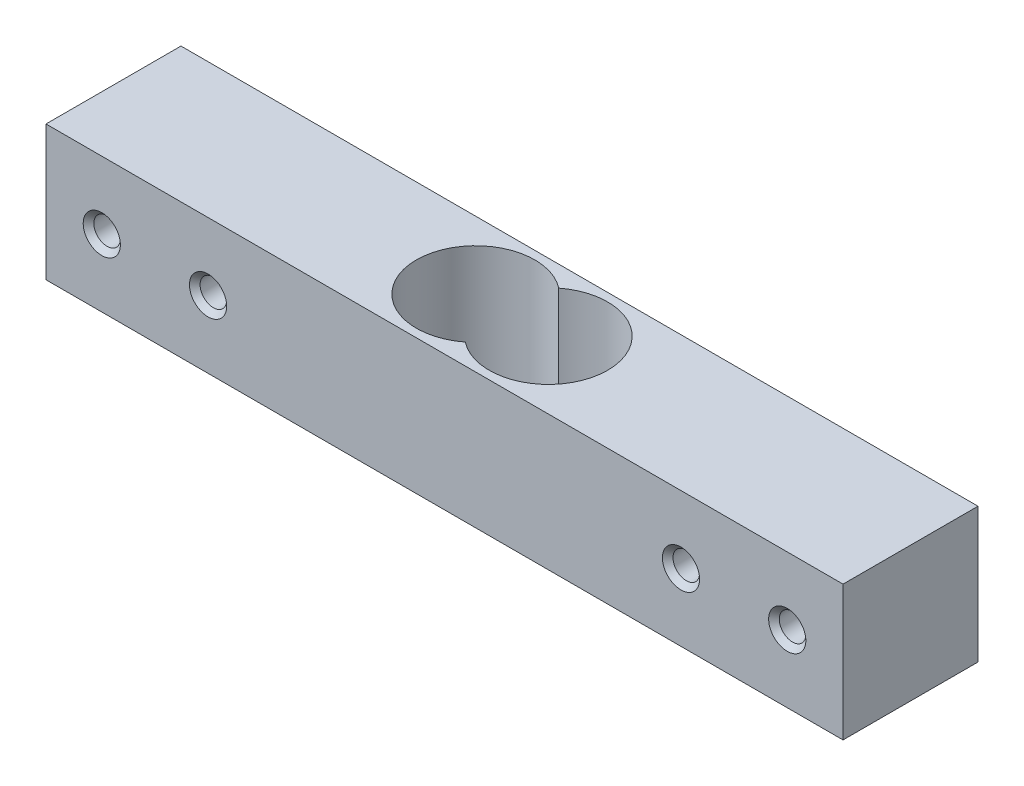
ISO-10303-21;
HEADER;
FILE_DESCRIPTION(('STEP AP214'),'2;1');
FILE_NAME('part.step','',(''),(''),'','','');
FILE_SCHEMA(('AUTOMOTIVE_DESIGN { 1 0 10303 214 1 1 1 1 }'));
ENDSEC;
DATA;
#1=APPLICATION_CONTEXT('core data for automotive mechanical design processes');
#2=APPLICATION_PROTOCOL_DEFINITION('international standard','automotive_design',2000,#1);
#3=PRODUCT_CONTEXT('',#1,'mechanical');
#4=PRODUCT('Part','Part','',(#3));
#5=PRODUCT_RELATED_PRODUCT_CATEGORY('part','',(#4));
#6=PRODUCT_DEFINITION_FORMATION('','',#4);
#7=PRODUCT_DEFINITION_CONTEXT('part definition',#1,'design');
#8=PRODUCT_DEFINITION('design','',#6,#7);
#9=PRODUCT_DEFINITION_SHAPE('','',#8);
#10=(LENGTH_UNIT() NAMED_UNIT(*) SI_UNIT(.MILLI.,.METRE.));
#11=(NAMED_UNIT(*) PLANE_ANGLE_UNIT() SI_UNIT($,.RADIAN.));
#12=(NAMED_UNIT(*) SI_UNIT($,.STERADIAN.) SOLID_ANGLE_UNIT());
#13=UNCERTAINTY_MEASURE_WITH_UNIT(LENGTH_MEASURE(1.E-05),#10,'distance_accuracy_value','');
#14=(GEOMETRIC_REPRESENTATION_CONTEXT(3) GLOBAL_UNCERTAINTY_ASSIGNED_CONTEXT((#13)) GLOBAL_UNIT_ASSIGNED_CONTEXT((#10,
#11,#12)) REPRESENTATION_CONTEXT('',''));
#15=CARTESIAN_POINT('',(0.,0.,0.));
#16=DIRECTION('',(0.,0.,1.));
#17=DIRECTION('',(1.,0.,0.));
#18=AXIS2_PLACEMENT_3D('',#15,#16,#17);
#19=CARTESIAN_POINT('',(0.,6.35,6.35));
#20=DIRECTION('',(0.,0.,-1.));
#21=DIRECTION('',(-1.,0.,0.));
#22=AXIS2_PLACEMENT_3D('',#19,#20,#21);
#23=PLANE('',#22);
#24=CARTESIAN_POINT('',(-32.25,0.,6.35));
#25=DIRECTION('',(0.,0.,-1.));
#26=DIRECTION('',(-1.,0.,0.));
#27=AXIS2_PLACEMENT_3D('',#24,#25,#26);
#28=CIRCLE('',#27,1.75);
#29=CARTESIAN_POINT('',(-34.,0.,6.35));
#30=VERTEX_POINT('',#29);
#31=EDGE_CURVE('E232',#30,#30,#28,.T.);
#32=ORIENTED_EDGE('',*,*,#31,.T.);
#33=EDGE_LOOP('',(#32));
#34=FACE_BOUND('',#33,.T.);
#35=CARTESIAN_POINT('',(-22.25,0.,6.35));
#36=DIRECTION('',(0.,0.,-1.));
#37=DIRECTION('',(-1.,0.,0.));
#38=AXIS2_PLACEMENT_3D('',#35,#36,#37);
#39=CIRCLE('',#38,1.75);
#40=CARTESIAN_POINT('',(-24.,0.,6.35));
#41=VERTEX_POINT('',#40);
#42=EDGE_CURVE('E240',#41,#41,#39,.T.);
#43=ORIENTED_EDGE('',*,*,#42,.T.);
#44=EDGE_LOOP('',(#43));
#45=FACE_BOUND('',#44,.T.);
#46=CARTESIAN_POINT('',(22.25,0.,6.35));
#47=DIRECTION('',(0.,0.,-1.));
#48=DIRECTION('',(-1.,0.,0.));
#49=AXIS2_PLACEMENT_3D('',#46,#47,#48);
#50=CIRCLE('',#49,1.75);
#51=CARTESIAN_POINT('',(20.5,0.,6.35));
#52=VERTEX_POINT('',#51);
#53=EDGE_CURVE('E249',#52,#52,#50,.T.);
#54=ORIENTED_EDGE('',*,*,#53,.T.);
#55=EDGE_LOOP('',(#54));
#56=FACE_BOUND('',#55,.T.);
#57=CARTESIAN_POINT('',(32.25,0.,6.35));
#58=DIRECTION('',(0.,0.,-1.));
#59=DIRECTION('',(-1.,0.,0.));
#60=AXIS2_PLACEMENT_3D('',#57,#58,#59);
#61=CIRCLE('',#60,1.74999999999999);
#62=CARTESIAN_POINT('',(30.5,0.,6.35));
#63=VERTEX_POINT('',#62);
#64=EDGE_CURVE('E212',#63,#63,#61,.T.);
#65=ORIENTED_EDGE('',*,*,#64,.T.);
#66=EDGE_LOOP('',(#65));
#67=FACE_BOUND('',#66,.T.);
#68=DIRECTION('',(1.,0.,0.));
#69=VECTOR('',#68,1.);
#70=CARTESIAN_POINT('',(0.,-6.35,6.35));
#71=LINE('',#70,#69);
#72=CARTESIAN_POINT('',(-37.5,-6.35,6.35));
#73=VERTEX_POINT('',#72);
#74=CARTESIAN_POINT('',(37.5,-6.35,6.35));
#75=VERTEX_POINT('',#74);
#76=EDGE_CURVE('E140',#73,#75,#71,.T.);
#77=ORIENTED_EDGE('',*,*,#76,.T.);
#78=DIRECTION('',(0.,-1.,0.));
#79=VECTOR('',#78,1.);
#80=CARTESIAN_POINT('',(37.5,6.35,6.35));
#81=LINE('',#80,#79);
#82=CARTESIAN_POINT('',(37.5,6.35,6.35));
#83=VERTEX_POINT('',#82);
#84=EDGE_CURVE('E11',#83,#75,#81,.T.);
#85=ORIENTED_EDGE('',*,*,#84,.F.);
#86=DIRECTION('',(1.,0.,0.));
#87=VECTOR('',#86,1.);
#88=CARTESIAN_POINT('',(0.,6.35,6.35));
#89=LINE('',#88,#87);
#90=CARTESIAN_POINT('',(-37.5,6.35,6.35));
#91=VERTEX_POINT('',#90);
#92=EDGE_CURVE('E108',#91,#83,#89,.T.);
#93=ORIENTED_EDGE('',*,*,#92,.F.);
#94=DIRECTION('',(0.,-1.,0.));
#95=VECTOR('',#94,1.);
#96=CARTESIAN_POINT('',(-37.5,6.35,6.35));
#97=LINE('',#96,#95);
#98=EDGE_CURVE('E60',#91,#73,#97,.T.);
#99=ORIENTED_EDGE('',*,*,#98,.T.);
#100=EDGE_LOOP('',(#77,#85,#93,#99));
#101=FACE_BOUND('',#100,.T.);
#102=ADVANCED_FACE('F40',(#34,#45,#56,#67,#101),#23,.F.);
#103=CARTESIAN_POINT('',(37.5,6.35,0.));
#104=DIRECTION('',(-1.,0.,0.));
#105=DIRECTION('',(0.,0.,1.));
#106=AXIS2_PLACEMENT_3D('',#103,#104,#105);
#107=PLANE('',#106);
#108=DIRECTION('',(0.,0.,-1.));
#109=VECTOR('',#108,1.);
#110=CARTESIAN_POINT('',(37.5,-6.35,0.));
#111=LINE('',#110,#109);
#112=CARTESIAN_POINT('',(37.5,-6.35,-6.35));
#113=VERTEX_POINT('',#112);
#114=EDGE_CURVE('E115',#75,#113,#111,.T.);
#115=ORIENTED_EDGE('',*,*,#114,.T.);
#116=DIRECTION('',(0.,-1.,0.));
#117=VECTOR('',#116,1.);
#118=CARTESIAN_POINT('',(37.5,6.35,-6.35));
#119=LINE('',#118,#117);
#120=CARTESIAN_POINT('',(37.5,6.35,-6.35));
#121=VERTEX_POINT('',#120);
#122=EDGE_CURVE('E51',#121,#113,#119,.T.);
#123=ORIENTED_EDGE('',*,*,#122,.F.);
#124=DIRECTION('',(0.,0.,-1.));
#125=VECTOR('',#124,1.);
#126=CARTESIAN_POINT('',(37.5,6.35,0.));
#127=LINE('',#126,#125);
#128=EDGE_CURVE('E102',#83,#121,#127,.T.);
#129=ORIENTED_EDGE('',*,*,#128,.F.);
#130=ORIENTED_EDGE('',*,*,#84,.T.);
#131=EDGE_LOOP('',(#115,#123,#129,#130));
#132=FACE_BOUND('',#131,.T.);
#133=ADVANCED_FACE('F114',(#132),#107,.F.);
#134=CARTESIAN_POINT('',(0.,6.35,-6.35));
#135=DIRECTION('',(0.,0.,-1.));
#136=DIRECTION('',(-1.,0.,0.));
#137=AXIS2_PLACEMENT_3D('',#134,#135,#136);
#138=PLANE('',#137);
#139=CARTESIAN_POINT('',(-32.25,0.,-6.35));
#140=DIRECTION('',(0.,0.,-1.));
#141=DIRECTION('',(-1.,0.,0.));
#142=AXIS2_PLACEMENT_3D('',#139,#140,#141);
#143=CIRCLE('',#142,1.75);
#144=CARTESIAN_POINT('',(-34.,0.,-6.35));
#145=VERTEX_POINT('',#144);
#146=EDGE_CURVE('E197',#145,#145,#143,.T.);
#147=ORIENTED_EDGE('',*,*,#146,.F.);
#148=EDGE_LOOP('',(#147));
#149=FACE_BOUND('',#148,.T.);
#150=CARTESIAN_POINT('',(-22.25,0.,-6.35));
#151=DIRECTION('',(0.,0.,-1.));
#152=DIRECTION('',(-1.,0.,0.));
#153=AXIS2_PLACEMENT_3D('',#150,#151,#152);
#154=CIRCLE('',#153,1.75);
#155=CARTESIAN_POINT('',(-24.,0.,-6.35));
#156=VERTEX_POINT('',#155);
#157=EDGE_CURVE('E201',#156,#156,#154,.T.);
#158=ORIENTED_EDGE('',*,*,#157,.F.);
#159=EDGE_LOOP('',(#158));
#160=FACE_BOUND('',#159,.T.);
#161=CARTESIAN_POINT('',(22.25,0.,-6.35));
#162=DIRECTION('',(0.,0.,-1.));
#163=DIRECTION('',(-1.,0.,0.));
#164=AXIS2_PLACEMENT_3D('',#161,#162,#163);
#165=CIRCLE('',#164,1.75);
#166=CARTESIAN_POINT('',(20.5,0.,-6.35));
#167=VERTEX_POINT('',#166);
#168=EDGE_CURVE('E205',#167,#167,#165,.T.);
#169=ORIENTED_EDGE('',*,*,#168,.F.);
#170=EDGE_LOOP('',(#169));
#171=FACE_BOUND('',#170,.T.);
#172=CARTESIAN_POINT('',(32.25,0.,-6.35));
#173=DIRECTION('',(0.,0.,-1.));
#174=DIRECTION('',(-1.,0.,0.));
#175=AXIS2_PLACEMENT_3D('',#172,#173,#174);
#176=CIRCLE('',#175,1.75);
#177=CARTESIAN_POINT('',(30.5,0.,-6.35));
#178=VERTEX_POINT('',#177);
#179=EDGE_CURVE('E208',#178,#178,#176,.T.);
#180=ORIENTED_EDGE('',*,*,#179,.F.);
#181=EDGE_LOOP('',(#180));
#182=FACE_BOUND('',#181,.T.);
#183=DIRECTION('',(1.,0.,0.));
#184=VECTOR('',#183,1.);
#185=CARTESIAN_POINT('',(0.,-6.35,-6.35));
#186=LINE('',#185,#184);
#187=CARTESIAN_POINT('',(-37.5,-6.35,-6.35));
#188=VERTEX_POINT('',#187);
#189=EDGE_CURVE('E145',#188,#113,#186,.T.);
#190=ORIENTED_EDGE('',*,*,#189,.F.);
#191=DIRECTION('',(0.,-1.,0.));
#192=VECTOR('',#191,1.);
#193=CARTESIAN_POINT('',(-37.5,6.35,-6.35));
#194=LINE('',#193,#192);
#195=CARTESIAN_POINT('',(-37.5,6.35,-6.35));
#196=VERTEX_POINT('',#195);
#197=EDGE_CURVE('E80',#196,#188,#194,.T.);
#198=ORIENTED_EDGE('',*,*,#197,.F.);
#199=DIRECTION('',(1.,0.,0.));
#200=VECTOR('',#199,1.);
#201=CARTESIAN_POINT('',(0.,6.35,-6.35));
#202=LINE('',#201,#200);
#203=EDGE_CURVE('E107',#196,#121,#202,.T.);
#204=ORIENTED_EDGE('',*,*,#203,.T.);
#205=ORIENTED_EDGE('',*,*,#122,.T.);
#206=EDGE_LOOP('',(#190,#198,#204,#205));
#207=FACE_BOUND('',#206,.T.);
#208=ADVANCED_FACE('F120',(#149,#160,#171,#182,#207),#138,.T.);
#209=CARTESIAN_POINT('',(3.425,6.35,0.));
#210=DIRECTION('',(0.,-1.,0.));
#211=DIRECTION('',(0.,0.,-1.));
#212=AXIS2_PLACEMENT_3D('',#209,#210,#211);
#213=CYLINDRICAL_SURFACE('',#212,5.575);
#214=CARTESIAN_POINT('',(3.425,-6.35,0.));
#215=DIRECTION('',(0.,1.,0.));
#216=DIRECTION('',(0.,0.,1.));
#217=AXIS2_PLACEMENT_3D('',#214,#215,#216);
#218=CIRCLE('',#217,5.575);
#219=CARTESIAN_POINT('',(0.,-6.35,4.39886348958455));
#220=VERTEX_POINT('',#219);
#221=CARTESIAN_POINT('',(0.,-6.35,-4.39886348958455));
#222=VERTEX_POINT('',#221);
#223=EDGE_CURVE('E131',#220,#222,#218,.T.);
#224=ORIENTED_EDGE('',*,*,#223,.F.);
#225=DIRECTION('',(0.,-1.,0.));
#226=VECTOR('',#225,1.);
#227=CARTESIAN_POINT('',(0.,6.35,4.39886348958455));
#228=LINE('',#227,#226);
#229=CARTESIAN_POINT('',(0.,6.35,4.39886348958455));
#230=VERTEX_POINT('',#229);
#231=EDGE_CURVE('E44',#230,#220,#228,.T.);
#232=ORIENTED_EDGE('',*,*,#231,.F.);
#233=CARTESIAN_POINT('',(3.425,6.35,0.));
#234=DIRECTION('',(0.,1.,0.));
#235=DIRECTION('',(0.,0.,1.));
#236=AXIS2_PLACEMENT_3D('',#233,#234,#235);
#237=CIRCLE('',#236,5.575);
#238=CARTESIAN_POINT('',(0.,6.35,-4.39886348958455));
#239=VERTEX_POINT('',#238);
#240=EDGE_CURVE('E152',#230,#239,#237,.T.);
#241=ORIENTED_EDGE('',*,*,#240,.T.);
#242=DIRECTION('',(0.,-1.,0.));
#243=VECTOR('',#242,1.);
#244=CARTESIAN_POINT('',(0.,6.35,-4.39886348958455));
#245=LINE('',#244,#243);
#246=EDGE_CURVE('E127',#239,#222,#245,.T.);
#247=ORIENTED_EDGE('',*,*,#246,.T.);
#248=EDGE_LOOP('',(#224,#232,#241,#247));
#249=FACE_BOUND('',#248,.T.);
#250=ADVANCED_FACE('F42',(#249),#213,.F.);
#251=CARTESIAN_POINT('',(-3.425,6.35,0.));
#252=DIRECTION('',(0.,-1.,0.));
#253=DIRECTION('',(0.,0.,-1.));
#254=AXIS2_PLACEMENT_3D('',#251,#252,#253);
#255=CYLINDRICAL_SURFACE('',#254,5.575);
#256=CARTESIAN_POINT('',(-3.425,-6.35,0.));
#257=DIRECTION('',(0.,1.,0.));
#258=DIRECTION('',(0.,0.,1.));
#259=AXIS2_PLACEMENT_3D('',#256,#257,#258);
#260=CIRCLE('',#259,5.575);
#261=EDGE_CURVE('E135',#222,#220,#260,.T.);
#262=ORIENTED_EDGE('',*,*,#261,.F.);
#263=ORIENTED_EDGE('',*,*,#246,.F.);
#264=CARTESIAN_POINT('',(-3.425,6.35,0.));
#265=DIRECTION('',(0.,1.,0.));
#266=DIRECTION('',(0.,0.,1.));
#267=AXIS2_PLACEMENT_3D('',#264,#265,#266);
#268=CIRCLE('',#267,5.575);
#269=EDGE_CURVE('E163',#239,#230,#268,.T.);
#270=ORIENTED_EDGE('',*,*,#269,.T.);
#271=ORIENTED_EDGE('',*,*,#231,.T.);
#272=EDGE_LOOP('',(#262,#263,#270,#271));
#273=FACE_BOUND('',#272,.T.);
#274=ADVANCED_FACE('F161',(#273),#255,.F.);
#275=CARTESIAN_POINT('',(-37.5,6.35,0.));
#276=DIRECTION('',(-1.,0.,0.));
#277=DIRECTION('',(0.,0.,1.));
#278=AXIS2_PLACEMENT_3D('',#275,#276,#277);
#279=PLANE('',#278);
#280=DIRECTION('',(0.,0.,-1.));
#281=VECTOR('',#280,1.);
#282=CARTESIAN_POINT('',(-37.5,-6.35,0.));
#283=LINE('',#282,#281);
#284=EDGE_CURVE('E148',#73,#188,#283,.T.);
#285=ORIENTED_EDGE('',*,*,#284,.F.);
#286=ORIENTED_EDGE('',*,*,#98,.F.);
#287=DIRECTION('',(0.,0.,-1.));
#288=VECTOR('',#287,1.);
#289=CARTESIAN_POINT('',(-37.5,6.35,0.));
#290=LINE('',#289,#288);
#291=EDGE_CURVE('E122',#91,#196,#290,.T.);
#292=ORIENTED_EDGE('',*,*,#291,.T.);
#293=ORIENTED_EDGE('',*,*,#197,.T.);
#294=EDGE_LOOP('',(#285,#286,#292,#293));
#295=FACE_BOUND('',#294,.T.);
#296=ADVANCED_FACE('F170',(#295),#279,.T.);
#297=CARTESIAN_POINT('',(0.,6.35,0.));
#298=DIRECTION('',(0.,1.,0.));
#299=DIRECTION('',(0.,0.,1.));
#300=AXIS2_PLACEMENT_3D('',#297,#298,#299);
#301=PLANE('',#300);
#302=ORIENTED_EDGE('',*,*,#240,.F.);
#303=ORIENTED_EDGE('',*,*,#269,.F.);
#304=EDGE_LOOP('',(#302,#303));
#305=FACE_BOUND('',#304,.T.);
#306=ORIENTED_EDGE('',*,*,#92,.T.);
#307=ORIENTED_EDGE('',*,*,#128,.T.);
#308=ORIENTED_EDGE('',*,*,#203,.F.);
#309=ORIENTED_EDGE('',*,*,#291,.F.);
#310=EDGE_LOOP('',(#306,#307,#308,#309));
#311=FACE_BOUND('',#310,.T.);
#312=ADVANCED_FACE('F104',(#305,#311),#301,.T.);
#313=CARTESIAN_POINT('',(0.,-6.35,0.));
#314=DIRECTION('',(0.,1.,0.));
#315=DIRECTION('',(0.,0.,1.));
#316=AXIS2_PLACEMENT_3D('',#313,#314,#315);
#317=PLANE('',#316);
#318=ORIENTED_EDGE('',*,*,#223,.T.);
#319=ORIENTED_EDGE('',*,*,#261,.T.);
#320=EDGE_LOOP('',(#318,#319));
#321=FACE_BOUND('',#320,.T.);
#322=ORIENTED_EDGE('',*,*,#76,.F.);
#323=ORIENTED_EDGE('',*,*,#284,.T.);
#324=ORIENTED_EDGE('',*,*,#189,.T.);
#325=ORIENTED_EDGE('',*,*,#114,.F.);
#326=EDGE_LOOP('',(#322,#323,#324,#325));
#327=FACE_BOUND('',#326,.T.);
#328=ADVANCED_FACE('F165',(#321,#327),#317,.F.);
#329=CARTESIAN_POINT('',(32.25,0.,5.85));
#330=DIRECTION('',(0.,0.,1.));
#331=DIRECTION('',(1.,0.,0.));
#332=AXIS2_PLACEMENT_3D('',#329,#330,#331);
#333=CONICAL_SURFACE('',#332,1.24999999999999,0.785398163397448);
#334=ORIENTED_EDGE('',*,*,#64,.F.);
#335=EDGE_LOOP('',(#334));
#336=FACE_BOUND('',#335,.T.);
#337=CARTESIAN_POINT('',(32.25,0.,5.85));
#338=DIRECTION('',(0.,0.,-1.));
#339=DIRECTION('',(-1.,0.,0.));
#340=AXIS2_PLACEMENT_3D('',#337,#338,#339);
#341=CIRCLE('',#340,1.24999999999999);
#342=CARTESIAN_POINT('',(31.,0.,5.85));
#343=VERTEX_POINT('',#342);
#344=EDGE_CURVE('E136',#343,#343,#341,.T.);
#345=ORIENTED_EDGE('',*,*,#344,.T.);
#346=EDGE_LOOP('',(#345));
#347=FACE_BOUND('',#346,.T.);
#348=ADVANCED_FACE('F168',(#336,#347),#333,.F.);
#349=CARTESIAN_POINT('',(32.25,0.,-6.35));
#350=DIRECTION('',(0.,0.,-1.));
#351=DIRECTION('',(-1.,0.,0.));
#352=AXIS2_PLACEMENT_3D('',#349,#350,#351);
#353=CYLINDRICAL_SURFACE('',#352,1.24999999999999);
#354=ORIENTED_EDGE('',*,*,#344,.F.);
#355=EDGE_LOOP('',(#354));
#356=FACE_BOUND('',#355,.T.);
#357=CARTESIAN_POINT('',(32.25,0.,-5.84999999999997));
#358=DIRECTION('',(0.,0.,-1.));
#359=DIRECTION('',(-1.,0.,0.));
#360=AXIS2_PLACEMENT_3D('',#357,#358,#359);
#361=CIRCLE('',#360,1.24999999999999);
#362=CARTESIAN_POINT('',(31.,0.,-5.84999999999997));
#363=VERTEX_POINT('',#362);
#364=EDGE_CURVE('E211',#363,#363,#361,.T.);
#365=ORIENTED_EDGE('',*,*,#364,.T.);
#366=EDGE_LOOP('',(#365));
#367=FACE_BOUND('',#366,.T.);
#368=ADVANCED_FACE('F293',(#356,#367),#353,.F.);
#369=CARTESIAN_POINT('',(32.25,0.,-6.35));
#370=DIRECTION('',(0.,0.,-1.));
#371=DIRECTION('',(-1.,0.,0.));
#372=AXIS2_PLACEMENT_3D('',#369,#370,#371);
#373=CONICAL_SURFACE('',#372,1.75,0.785398163397433);
#374=ORIENTED_EDGE('',*,*,#364,.F.);
#375=EDGE_LOOP('',(#374));
#376=FACE_BOUND('',#375,.T.);
#377=ORIENTED_EDGE('',*,*,#179,.T.);
#378=EDGE_LOOP('',(#377));
#379=FACE_BOUND('',#378,.T.);
#380=ADVANCED_FACE('F289',(#376,#379),#373,.F.);
#381=CARTESIAN_POINT('',(22.25,0.,5.85));
#382=DIRECTION('',(0.,0.,1.));
#383=DIRECTION('',(1.,0.,0.));
#384=AXIS2_PLACEMENT_3D('',#381,#382,#383);
#385=CONICAL_SURFACE('',#384,1.25,0.785398163397448);
#386=ORIENTED_EDGE('',*,*,#53,.F.);
#387=EDGE_LOOP('',(#386));
#388=FACE_BOUND('',#387,.T.);
#389=CARTESIAN_POINT('',(22.25,0.,5.85));
#390=DIRECTION('',(0.,0.,-1.));
#391=DIRECTION('',(-1.,0.,0.));
#392=AXIS2_PLACEMENT_3D('',#389,#390,#391);
#393=CIRCLE('',#392,1.25);
#394=CARTESIAN_POINT('',(21.,0.,5.85));
#395=VERTEX_POINT('',#394);
#396=EDGE_CURVE('E219',#395,#395,#393,.T.);
#397=ORIENTED_EDGE('',*,*,#396,.T.);
#398=EDGE_LOOP('',(#397));
#399=FACE_BOUND('',#398,.T.);
#400=ADVANCED_FACE('F282',(#388,#399),#385,.F.);
#401=CARTESIAN_POINT('',(22.25,0.,-6.35));
#402=DIRECTION('',(0.,0.,-1.));
#403=DIRECTION('',(-1.,0.,0.));
#404=AXIS2_PLACEMENT_3D('',#401,#402,#403);
#405=CYLINDRICAL_SURFACE('',#404,1.24999999999999);
#406=ORIENTED_EDGE('',*,*,#396,.F.);
#407=EDGE_LOOP('',(#406));
#408=FACE_BOUND('',#407,.T.);
#409=CARTESIAN_POINT('',(22.25,0.,-5.84999999999997));
#410=DIRECTION('',(0.,0.,-1.));
#411=DIRECTION('',(-1.,0.,0.));
#412=AXIS2_PLACEMENT_3D('',#409,#410,#411);
#413=CIRCLE('',#412,1.24999999999999);
#414=CARTESIAN_POINT('',(21.,0.,-5.84999999999997));
#415=VERTEX_POINT('',#414);
#416=EDGE_CURVE('E236',#415,#415,#413,.T.);
#417=ORIENTED_EDGE('',*,*,#416,.T.);
#418=EDGE_LOOP('',(#417));
#419=FACE_BOUND('',#418,.T.);
#420=ADVANCED_FACE('F268',(#408,#419),#405,.F.);
#421=CARTESIAN_POINT('',(22.25,0.,-6.35));
#422=DIRECTION('',(0.,0.,-1.));
#423=DIRECTION('',(-1.,0.,0.));
#424=AXIS2_PLACEMENT_3D('',#421,#422,#423);
#425=CONICAL_SURFACE('',#424,1.75,0.785398163397433);
#426=ORIENTED_EDGE('',*,*,#416,.F.);
#427=EDGE_LOOP('',(#426));
#428=FACE_BOUND('',#427,.T.);
#429=ORIENTED_EDGE('',*,*,#168,.T.);
#430=EDGE_LOOP('',(#429));
#431=FACE_BOUND('',#430,.T.);
#432=ADVANCED_FACE('F270',(#428,#431),#425,.F.);
#433=CARTESIAN_POINT('',(-22.25,0.,5.85));
#434=DIRECTION('',(0.,0.,1.));
#435=DIRECTION('',(1.,0.,0.));
#436=AXIS2_PLACEMENT_3D('',#433,#434,#435);
#437=CONICAL_SURFACE('',#436,1.25,0.785398163397448);
#438=ORIENTED_EDGE('',*,*,#42,.F.);
#439=EDGE_LOOP('',(#438));
#440=FACE_BOUND('',#439,.T.);
#441=CARTESIAN_POINT('',(-22.25,0.,5.85));
#442=DIRECTION('',(0.,0.,-1.));
#443=DIRECTION('',(-1.,0.,0.));
#444=AXIS2_PLACEMENT_3D('',#441,#442,#443);
#445=CIRCLE('',#444,1.25);
#446=CARTESIAN_POINT('',(-23.5,0.,5.85));
#447=VERTEX_POINT('',#446);
#448=EDGE_CURVE('E252',#447,#447,#445,.T.);
#449=ORIENTED_EDGE('',*,*,#448,.T.);
#450=EDGE_LOOP('',(#449));
#451=FACE_BOUND('',#450,.T.);
#452=ADVANCED_FACE('F273',(#440,#451),#437,.F.);
#453=CARTESIAN_POINT('',(-22.25,0.,-6.35));
#454=DIRECTION('',(0.,0.,-1.));
#455=DIRECTION('',(-1.,0.,0.));
#456=AXIS2_PLACEMENT_3D('',#453,#454,#455);
#457=CYLINDRICAL_SURFACE('',#456,1.24999999999999);
#458=ORIENTED_EDGE('',*,*,#448,.F.);
#459=EDGE_LOOP('',(#458));
#460=FACE_BOUND('',#459,.T.);
#461=CARTESIAN_POINT('',(-22.25,0.,-5.84999999999997));
#462=DIRECTION('',(0.,0.,-1.));
#463=DIRECTION('',(-1.,0.,0.));
#464=AXIS2_PLACEMENT_3D('',#461,#462,#463);
#465=CIRCLE('',#464,1.24999999999999);
#466=CARTESIAN_POINT('',(-23.5,0.,-5.84999999999997));
#467=VERTEX_POINT('',#466);
#468=EDGE_CURVE('E247',#467,#467,#465,.T.);
#469=ORIENTED_EDGE('',*,*,#468,.T.);
#470=EDGE_LOOP('',(#469));
#471=FACE_BOUND('',#470,.T.);
#472=ADVANCED_FACE('F279',(#460,#471),#457,.F.);
#473=CARTESIAN_POINT('',(-22.25,0.,-6.35));
#474=DIRECTION('',(0.,0.,-1.));
#475=DIRECTION('',(-1.,0.,0.));
#476=AXIS2_PLACEMENT_3D('',#473,#474,#475);
#477=CONICAL_SURFACE('',#476,1.75,0.785398163397433);
#478=ORIENTED_EDGE('',*,*,#468,.F.);
#479=EDGE_LOOP('',(#478));
#480=FACE_BOUND('',#479,.T.);
#481=ORIENTED_EDGE('',*,*,#157,.T.);
#482=EDGE_LOOP('',(#481));
#483=FACE_BOUND('',#482,.T.);
#484=ADVANCED_FACE('F338',(#480,#483),#477,.F.);
#485=CARTESIAN_POINT('',(-32.25,0.,5.85));
#486=DIRECTION('',(0.,0.,1.));
#487=DIRECTION('',(1.,0.,0.));
#488=AXIS2_PLACEMENT_3D('',#485,#486,#487);
#489=CONICAL_SURFACE('',#488,1.25,0.785398163397448);
#490=ORIENTED_EDGE('',*,*,#31,.F.);
#491=EDGE_LOOP('',(#490));
#492=FACE_BOUND('',#491,.T.);
#493=CARTESIAN_POINT('',(-32.25,0.,5.85));
#494=DIRECTION('',(0.,0.,-1.));
#495=DIRECTION('',(-1.,0.,0.));
#496=AXIS2_PLACEMENT_3D('',#493,#494,#495);
#497=CIRCLE('',#496,1.25);
#498=CARTESIAN_POINT('',(-33.5,0.,5.85));
#499=VERTEX_POINT('',#498);
#500=EDGE_CURVE('E238',#499,#499,#497,.T.);
#501=ORIENTED_EDGE('',*,*,#500,.T.);
#502=EDGE_LOOP('',(#501));
#503=FACE_BOUND('',#502,.T.);
#504=ADVANCED_FACE('F346',(#492,#503),#489,.F.);
#505=CARTESIAN_POINT('',(-32.25,0.,-6.35));
#506=DIRECTION('',(0.,0.,-1.));
#507=DIRECTION('',(-1.,0.,0.));
#508=AXIS2_PLACEMENT_3D('',#505,#506,#507);
#509=CYLINDRICAL_SURFACE('',#508,1.24999999999999);
#510=ORIENTED_EDGE('',*,*,#500,.F.);
#511=EDGE_LOOP('',(#510));
#512=FACE_BOUND('',#511,.T.);
#513=CARTESIAN_POINT('',(-32.25,0.,-5.84999999999997));
#514=DIRECTION('',(0.,0.,-1.));
#515=DIRECTION('',(-1.,0.,0.));
#516=AXIS2_PLACEMENT_3D('',#513,#514,#515);
#517=CIRCLE('',#516,1.24999999999999);
#518=CARTESIAN_POINT('',(-33.5,0.,-5.84999999999997));
#519=VERTEX_POINT('',#518);
#520=EDGE_CURVE('E241',#519,#519,#517,.T.);
#521=ORIENTED_EDGE('',*,*,#520,.T.);
#522=EDGE_LOOP('',(#521));
#523=FACE_BOUND('',#522,.T.);
#524=ADVANCED_FACE('F355',(#512,#523),#509,.F.);
#525=CARTESIAN_POINT('',(-32.25,0.,-6.35));
#526=DIRECTION('',(0.,0.,-1.));
#527=DIRECTION('',(-1.,0.,0.));
#528=AXIS2_PLACEMENT_3D('',#525,#526,#527);
#529=CONICAL_SURFACE('',#528,1.75,0.785398163397433);
#530=ORIENTED_EDGE('',*,*,#520,.F.);
#531=EDGE_LOOP('',(#530));
#532=FACE_BOUND('',#531,.T.);
#533=ORIENTED_EDGE('',*,*,#146,.T.);
#534=EDGE_LOOP('',(#533));
#535=FACE_BOUND('',#534,.T.);
#536=ADVANCED_FACE('F364',(#532,#535),#529,.F.);
#537=CLOSED_SHELL('',(#102,#133,#208,#250,#274,#296,#312,#328,#348,#368,#380,#400,#420,#432,
#452,#472,#484,#504,#524,#536));
#538=MANIFOLD_SOLID_BREP('B2',#537);
#539=ADVANCED_BREP_SHAPE_REPRESENTATION('',(#18,#538),#14);
#540=SHAPE_DEFINITION_REPRESENTATION(#9,#539);
ENDSEC;
END-ISO-10303-21;
